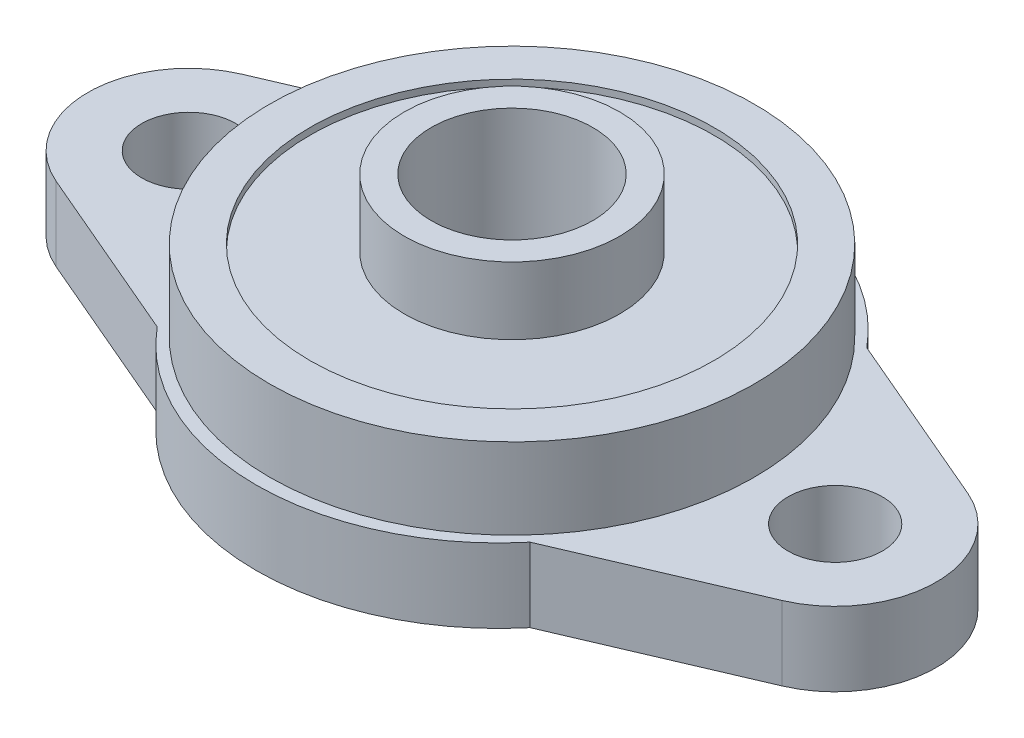
ISO-10303-21;
HEADER;
FILE_DESCRIPTION(('STEP AP214'),'2;1');
FILE_NAME('part.step','',(''),(''),'','','');
FILE_SCHEMA(('AUTOMOTIVE_DESIGN { 1 0 10303 214 1 1 1 1 }'));
ENDSEC;
DATA;
#1=APPLICATION_CONTEXT('core data for automotive mechanical design processes');
#2=APPLICATION_PROTOCOL_DEFINITION('international standard','automotive_design',2000,#1);
#3=PRODUCT_CONTEXT('',#1,'mechanical');
#4=PRODUCT('Part','Part','',(#3));
#5=PRODUCT_RELATED_PRODUCT_CATEGORY('part','',(#4));
#6=PRODUCT_DEFINITION_FORMATION('','',#4);
#7=PRODUCT_DEFINITION_CONTEXT('part definition',#1,'design');
#8=PRODUCT_DEFINITION('design','',#6,#7);
#9=PRODUCT_DEFINITION_SHAPE('','',#8);
#10=(LENGTH_UNIT() NAMED_UNIT(*) SI_UNIT(.MILLI.,.METRE.));
#11=(NAMED_UNIT(*) PLANE_ANGLE_UNIT() SI_UNIT($,.RADIAN.));
#12=(NAMED_UNIT(*) SI_UNIT($,.STERADIAN.) SOLID_ANGLE_UNIT());
#13=UNCERTAINTY_MEASURE_WITH_UNIT(LENGTH_MEASURE(1.E-05),#10,'distance_accuracy_value','');
#14=(GEOMETRIC_REPRESENTATION_CONTEXT(3) GLOBAL_UNCERTAINTY_ASSIGNED_CONTEXT((#13)) GLOBAL_UNIT_ASSIGNED_CONTEXT((#10,
#11,#12)) REPRESENTATION_CONTEXT('',''));
#15=CARTESIAN_POINT('',(0.,0.,0.));
#16=DIRECTION('',(0.,0.,1.));
#17=DIRECTION('',(1.,0.,0.));
#18=AXIS2_PLACEMENT_3D('',#15,#16,#17);
#19=CARTESIAN_POINT('',(0.,-5.5,0.));
#20=DIRECTION('',(0.,1.,0.));
#21=DIRECTION('',(0.,0.,1.));
#22=AXIS2_PLACEMENT_3D('',#19,#20,#21);
#23=PLANE('',#22);
#24=CARTESIAN_POINT('',(0.,-5.5,0.));
#25=DIRECTION('',(0.,1.,0.));
#26=DIRECTION('',(0.,0.,1.));
#27=AXIS2_PLACEMENT_3D('',#24,#25,#26);
#28=CIRCLE('',#27,6.);
#29=CARTESIAN_POINT('',(0.,-5.5,6.));
#30=VERTEX_POINT('',#29);
#31=EDGE_CURVE('E152',#30,#30,#28,.T.);
#32=ORIENTED_EDGE('',*,*,#31,.T.);
#33=EDGE_LOOP('',(#32));
#34=FACE_BOUND('',#33,.T.);
#35=CARTESIAN_POINT('',(0.,-5.5,0.));
#36=DIRECTION('',(0.,-1.,0.));
#37=DIRECTION('',(0.,0.,-1.));
#38=AXIS2_PLACEMENT_3D('',#35,#36,#37);
#39=CIRCLE('',#38,8.);
#40=CARTESIAN_POINT('',(0.,-5.5,-8.));
#41=VERTEX_POINT('',#40);
#42=EDGE_CURVE('E274',#41,#41,#39,.T.);
#43=ORIENTED_EDGE('',*,*,#42,.T.);
#44=EDGE_LOOP('',(#43));
#45=FACE_BOUND('',#44,.T.);
#46=ADVANCED_FACE('F42',(#34,#45),#23,.F.);
#47=CARTESIAN_POINT('',(24.,-5.5,0.));
#48=DIRECTION('',(0.,1.,0.));
#49=DIRECTION('',(0.,0.,1.));
#50=AXIS2_PLACEMENT_3D('',#47,#48,#49);
#51=CYLINDRICAL_SURFACE('',#50,7.50000000000001);
#52=CARTESIAN_POINT('',(24.,0.,0.));
#53=DIRECTION('',(0.,1.,0.));
#54=DIRECTION('',(0.,0.,1.));
#55=AXIS2_PLACEMENT_3D('',#52,#53,#54);
#56=CIRCLE('',#55,7.50000000000001);
#57=CARTESIAN_POINT('',(26.9495578824356,0.,-6.89565865586182));
#58=VERTEX_POINT('',#57);
#59=CARTESIAN_POINT('',(26.9495578824356,0.,6.89565865586182));
#60=VERTEX_POINT('',#59);
#61=EDGE_CURVE('E160',#58,#60,#56,.F.);
#62=ORIENTED_EDGE('',*,*,#61,.T.);
#63=DIRECTION('',(0.,1.,0.));
#64=VECTOR('',#63,1.);
#65=CARTESIAN_POINT('',(26.9495578824356,-5.5,6.89565865586182));
#66=LINE('',#65,#64);
#67=CARTESIAN_POINT('',(26.9495578824356,-5.5,6.89565865586182));
#68=VERTEX_POINT('',#67);
#69=EDGE_CURVE('E52',#68,#60,#66,.T.);
#70=ORIENTED_EDGE('',*,*,#69,.F.);
#71=CARTESIAN_POINT('',(24.,-5.5,0.));
#72=DIRECTION('',(0.,1.,0.));
#73=DIRECTION('',(0.,0.,1.));
#74=AXIS2_PLACEMENT_3D('',#71,#72,#73);
#75=CIRCLE('',#74,7.50000000000001);
#76=CARTESIAN_POINT('',(26.9495578824356,-5.5,-6.89565865586182));
#77=VERTEX_POINT('',#76);
#78=EDGE_CURVE('E211',#77,#68,#75,.F.);
#79=ORIENTED_EDGE('',*,*,#78,.F.);
#80=DIRECTION('',(0.,1.,0.));
#81=VECTOR('',#80,1.);
#82=CARTESIAN_POINT('',(26.9495578824356,-5.5,-6.89565865586182));
#83=LINE('',#82,#81);
#84=EDGE_CURVE('E102',#77,#58,#83,.T.);
#85=ORIENTED_EDGE('',*,*,#84,.T.);
#86=EDGE_LOOP('',(#62,#70,#79,#85));
#87=FACE_BOUND('',#86,.T.);
#88=ADVANCED_FACE('F209',(#87),#51,.T.);
#89=CARTESIAN_POINT('',(6.6615116752198,-5.5,15.5736935755344));
#90=DIRECTION('',(-0.393274384324746,0.,-0.919421154114909));
#91=DIRECTION('',(-0.919421154114909,0.,0.393274384324746));
#92=AXIS2_PLACEMENT_3D('',#89,#90,#91);
#93=PLANE('',#92);
#94=DIRECTION('',(-0.919421154114909,0.,0.393274384324746));
#95=VECTOR('',#94,1.);
#96=CARTESIAN_POINT('',(6.6615116752198,0.,15.5736935755344));
#97=LINE('',#96,#95);
#98=CARTESIAN_POINT('',(13.8473824241262,0.,12.5));
#99=VERTEX_POINT('',#98);
#100=EDGE_CURVE('E95',#60,#99,#97,.T.);
#101=ORIENTED_EDGE('',*,*,#100,.T.);
#102=DIRECTION('',(0.,1.,0.));
#103=VECTOR('',#102,1.);
#104=CARTESIAN_POINT('',(13.8473824241262,-5.5,12.5));
#105=LINE('',#104,#103);
#106=CARTESIAN_POINT('',(13.8473824241262,-5.5,12.5));
#107=VERTEX_POINT('',#106);
#108=EDGE_CURVE('E88',#107,#99,#105,.T.);
#109=ORIENTED_EDGE('',*,*,#108,.F.);
#110=DIRECTION('',(-0.919421154114909,0.,0.393274384324746));
#111=VECTOR('',#110,1.);
#112=CARTESIAN_POINT('',(6.6615116752198,-5.5,15.5736935755344));
#113=LINE('',#112,#111);
#114=EDGE_CURVE('E60',#68,#107,#113,.T.);
#115=ORIENTED_EDGE('',*,*,#114,.F.);
#116=ORIENTED_EDGE('',*,*,#69,.T.);
#117=EDGE_LOOP('',(#101,#109,#115,#116));
#118=FACE_BOUND('',#117,.T.);
#119=ADVANCED_FACE('F327',(#118),#93,.F.);
#120=CARTESIAN_POINT('',(0.,-5.5,1.));
#121=DIRECTION('',(0.,1.,0.));
#122=DIRECTION('',(0.,0.,1.));
#123=AXIS2_PLACEMENT_3D('',#120,#121,#122);
#124=CYLINDRICAL_SURFACE('',#123,18.);
#125=CARTESIAN_POINT('',(0.,0.,1.));
#126=DIRECTION('',(0.,1.,0.));
#127=DIRECTION('',(0.,0.,1.));
#128=AXIS2_PLACEMENT_3D('',#125,#126,#127);
#129=CIRCLE('',#128,18.);
#130=CARTESIAN_POINT('',(-13.8473824241262,0.,12.5));
#131=VERTEX_POINT('',#130);
#132=EDGE_CURVE('E120',#131,#99,#129,.T.);
#133=ORIENTED_EDGE('',*,*,#132,.F.);
#134=DIRECTION('',(0.,1.,0.));
#135=VECTOR('',#134,1.);
#136=CARTESIAN_POINT('',(-13.8473824241262,-5.5,12.5));
#137=LINE('',#136,#135);
#138=CARTESIAN_POINT('',(-13.8473824241262,-5.5,12.5));
#139=VERTEX_POINT('',#138);
#140=EDGE_CURVE('E116',#139,#131,#137,.T.);
#141=ORIENTED_EDGE('',*,*,#140,.F.);
#142=CARTESIAN_POINT('',(0.,-5.5,1.));
#143=DIRECTION('',(0.,1.,0.));
#144=DIRECTION('',(0.,0.,1.));
#145=AXIS2_PLACEMENT_3D('',#142,#143,#144);
#146=CIRCLE('',#145,18.);
#147=EDGE_CURVE('E119',#139,#107,#146,.T.);
#148=ORIENTED_EDGE('',*,*,#147,.T.);
#149=ORIENTED_EDGE('',*,*,#108,.T.);
#150=EDGE_LOOP('',(#133,#141,#148,#149));
#151=FACE_BOUND('',#150,.T.);
#152=ADVANCED_FACE('F118',(#151),#124,.T.);
#153=CARTESIAN_POINT('',(-6.66151167521981,-5.5,15.5736935755344));
#154=DIRECTION('',(-0.393274384324747,0.,0.919421154114909));
#155=DIRECTION('',(0.919421154114909,0.,0.393274384324747));
#156=AXIS2_PLACEMENT_3D('',#153,#154,#155);
#157=PLANE('',#156);
#158=DIRECTION('',(0.919421154114909,0.,0.393274384324747));
#159=VECTOR('',#158,1.);
#160=CARTESIAN_POINT('',(-6.66151167521981,0.,15.5736935755344));
#161=LINE('',#160,#159);
#162=CARTESIAN_POINT('',(-26.9495578824356,0.,6.89565865586182));
#163=VERTEX_POINT('',#162);
#164=EDGE_CURVE('E180',#163,#131,#161,.T.);
#165=ORIENTED_EDGE('',*,*,#164,.F.);
#166=DIRECTION('',(0.,1.,0.));
#167=VECTOR('',#166,1.);
#168=CARTESIAN_POINT('',(-26.9495578824356,-5.5,6.89565865586182));
#169=LINE('',#168,#167);
#170=CARTESIAN_POINT('',(-26.9495578824356,-5.5,6.89565865586182));
#171=VERTEX_POINT('',#170);
#172=EDGE_CURVE('E126',#171,#163,#169,.T.);
#173=ORIENTED_EDGE('',*,*,#172,.F.);
#174=DIRECTION('',(0.919421154114909,0.,0.393274384324747));
#175=VECTOR('',#174,1.);
#176=CARTESIAN_POINT('',(-6.66151167521981,-5.5,15.5736935755344));
#177=LINE('',#176,#175);
#178=EDGE_CURVE('E133',#171,#139,#177,.T.);
#179=ORIENTED_EDGE('',*,*,#178,.T.);
#180=ORIENTED_EDGE('',*,*,#140,.T.);
#181=EDGE_LOOP('',(#165,#173,#179,#180));
#182=FACE_BOUND('',#181,.T.);
#183=ADVANCED_FACE('F137',(#182),#157,.T.);
#184=CARTESIAN_POINT('',(-24.,-5.5,0.));
#185=DIRECTION('',(0.,1.,0.));
#186=DIRECTION('',(0.,0.,1.));
#187=AXIS2_PLACEMENT_3D('',#184,#185,#186);
#188=CYLINDRICAL_SURFACE('',#187,7.5);
#189=CARTESIAN_POINT('',(-24.,0.,0.));
#190=DIRECTION('',(0.,1.,0.));
#191=DIRECTION('',(0.,0.,1.));
#192=AXIS2_PLACEMENT_3D('',#189,#190,#191);
#193=CIRCLE('',#192,7.5);
#194=CARTESIAN_POINT('',(-26.9495578824356,0.,-6.89565865586182));
#195=VERTEX_POINT('',#194);
#196=EDGE_CURVE('E176',#195,#163,#193,.T.);
#197=ORIENTED_EDGE('',*,*,#196,.F.);
#198=DIRECTION('',(0.,1.,0.));
#199=VECTOR('',#198,1.);
#200=CARTESIAN_POINT('',(-26.9495578824356,-5.5,-6.89565865586182));
#201=LINE('',#200,#199);
#202=CARTESIAN_POINT('',(-26.9495578824356,-5.5,-6.89565865586182));
#203=VERTEX_POINT('',#202);
#204=EDGE_CURVE('E198',#203,#195,#201,.T.);
#205=ORIENTED_EDGE('',*,*,#204,.F.);
#206=CARTESIAN_POINT('',(-24.,-5.5,0.));
#207=DIRECTION('',(0.,1.,0.));
#208=DIRECTION('',(0.,0.,1.));
#209=AXIS2_PLACEMENT_3D('',#206,#207,#208);
#210=CIRCLE('',#209,7.5);
#211=EDGE_CURVE('E139',#203,#171,#210,.T.);
#212=ORIENTED_EDGE('',*,*,#211,.T.);
#213=ORIENTED_EDGE('',*,*,#172,.T.);
#214=EDGE_LOOP('',(#197,#205,#212,#213));
#215=FACE_BOUND('',#214,.T.);
#216=ADVANCED_FACE('F227',(#215),#188,.T.);
#217=CARTESIAN_POINT('',(-6.66151167521981,-5.5,-15.5736935755344));
#218=DIRECTION('',(0.393274384324747,0.,0.919421154114909));
#219=DIRECTION('',(0.919421154114909,0.,-0.393274384324747));
#220=AXIS2_PLACEMENT_3D('',#217,#218,#219);
#221=PLANE('',#220);
#222=DIRECTION('',(0.919421154114909,0.,-0.393274384324747));
#223=VECTOR('',#222,1.);
#224=CARTESIAN_POINT('',(-6.66151167521981,0.,-15.5736935755344));
#225=LINE('',#224,#223);
#226=CARTESIAN_POINT('',(-13.8473824241262,0.,-12.5));
#227=VERTEX_POINT('',#226);
#228=EDGE_CURVE('E173',#195,#227,#225,.T.);
#229=ORIENTED_EDGE('',*,*,#228,.T.);
#230=DIRECTION('',(0.,1.,0.));
#231=VECTOR('',#230,1.);
#232=CARTESIAN_POINT('',(-13.8473824241262,-5.5,-12.5));
#233=LINE('',#232,#231);
#234=CARTESIAN_POINT('',(-13.8473824241262,-5.5,-12.5));
#235=VERTEX_POINT('',#234);
#236=EDGE_CURVE('E201',#235,#227,#233,.T.);
#237=ORIENTED_EDGE('',*,*,#236,.F.);
#238=DIRECTION('',(0.919421154114909,0.,-0.393274384324747));
#239=VECTOR('',#238,1.);
#240=CARTESIAN_POINT('',(-6.66151167521981,-5.5,-15.5736935755344));
#241=LINE('',#240,#239);
#242=EDGE_CURVE('E142',#203,#235,#241,.T.);
#243=ORIENTED_EDGE('',*,*,#242,.F.);
#244=ORIENTED_EDGE('',*,*,#204,.T.);
#245=EDGE_LOOP('',(#229,#237,#243,#244));
#246=FACE_BOUND('',#245,.T.);
#247=ADVANCED_FACE('F231',(#246),#221,.F.);
#248=CARTESIAN_POINT('',(0.,-5.5,-1.));
#249=DIRECTION('',(0.,1.,0.));
#250=DIRECTION('',(0.,0.,1.));
#251=AXIS2_PLACEMENT_3D('',#248,#249,#250);
#252=CYLINDRICAL_SURFACE('',#251,18.);
#253=CARTESIAN_POINT('',(0.,0.,-1.));
#254=DIRECTION('',(0.,1.,0.));
#255=DIRECTION('',(0.,0.,1.));
#256=AXIS2_PLACEMENT_3D('',#253,#254,#255);
#257=CIRCLE('',#256,18.);
#258=CARTESIAN_POINT('',(13.8473824241262,0.,-12.5));
#259=VERTEX_POINT('',#258);
#260=EDGE_CURVE('E169',#227,#259,#257,.F.);
#261=ORIENTED_EDGE('',*,*,#260,.T.);
#262=DIRECTION('',(0.,1.,0.));
#263=VECTOR('',#262,1.);
#264=CARTESIAN_POINT('',(13.8473824241262,-5.5,-12.5));
#265=LINE('',#264,#263);
#266=CARTESIAN_POINT('',(13.8473824241262,-5.5,-12.5));
#267=VERTEX_POINT('',#266);
#268=EDGE_CURVE('E205',#267,#259,#265,.T.);
#269=ORIENTED_EDGE('',*,*,#268,.F.);
#270=CARTESIAN_POINT('',(0.,-5.5,-1.));
#271=DIRECTION('',(0.,1.,0.));
#272=DIRECTION('',(0.,0.,1.));
#273=AXIS2_PLACEMENT_3D('',#270,#271,#272);
#274=CIRCLE('',#273,18.);
#275=EDGE_CURVE('E229',#235,#267,#274,.F.);
#276=ORIENTED_EDGE('',*,*,#275,.F.);
#277=ORIENTED_EDGE('',*,*,#236,.T.);
#278=EDGE_LOOP('',(#261,#269,#276,#277));
#279=FACE_BOUND('',#278,.T.);
#280=ADVANCED_FACE('F221',(#279),#252,.T.);
#281=CARTESIAN_POINT('',(24.,-5.5,0.));
#282=DIRECTION('',(0.,1.,0.));
#283=DIRECTION('',(0.,0.,1.));
#284=AXIS2_PLACEMENT_3D('',#281,#282,#283);
#285=CYLINDRICAL_SURFACE('',#284,3.5);
#286=CARTESIAN_POINT('',(24.,-5.5,0.));
#287=DIRECTION('',(0.,1.,0.));
#288=DIRECTION('',(0.,0.,1.));
#289=AXIS2_PLACEMENT_3D('',#286,#287,#288);
#290=CIRCLE('',#289,3.5);
#291=CARTESIAN_POINT('',(24.,-5.5,3.50000000000001));
#292=VERTEX_POINT('',#291);
#293=EDGE_CURVE('E148',#292,#292,#290,.F.);
#294=ORIENTED_EDGE('',*,*,#293,.T.);
#295=EDGE_LOOP('',(#294));
#296=FACE_BOUND('',#295,.T.);
#297=CARTESIAN_POINT('',(24.,0.,0.));
#298=DIRECTION('',(0.,1.,0.));
#299=DIRECTION('',(0.,0.,1.));
#300=AXIS2_PLACEMENT_3D('',#297,#298,#299);
#301=CIRCLE('',#300,3.5);
#302=CARTESIAN_POINT('',(24.,0.,3.50000000000001));
#303=VERTEX_POINT('',#302);
#304=EDGE_CURVE('E187',#303,#303,#301,.F.);
#305=ORIENTED_EDGE('',*,*,#304,.F.);
#306=EDGE_LOOP('',(#305));
#307=FACE_BOUND('',#306,.T.);
#308=ADVANCED_FACE('F430',(#296,#307),#285,.F.);
#309=CARTESIAN_POINT('',(6.6615116752198,-5.5,-15.5736935755344));
#310=DIRECTION('',(0.393274384324746,0.,-0.919421154114909));
#311=DIRECTION('',(-0.919421154114909,0.,-0.393274384324746));
#312=AXIS2_PLACEMENT_3D('',#309,#310,#311);
#313=PLANE('',#312);
#314=DIRECTION('',(-0.919421154114909,0.,-0.393274384324746));
#315=VECTOR('',#314,1.);
#316=CARTESIAN_POINT('',(6.6615116752198,0.,-15.5736935755344));
#317=LINE('',#316,#315);
#318=EDGE_CURVE('E165',#58,#259,#317,.T.);
#319=ORIENTED_EDGE('',*,*,#318,.F.);
#320=ORIENTED_EDGE('',*,*,#84,.F.);
#321=DIRECTION('',(-0.919421154114909,0.,-0.393274384324746));
#322=VECTOR('',#321,1.);
#323=CARTESIAN_POINT('',(6.6615116752198,-5.5,-15.5736935755344));
#324=LINE('',#323,#322);
#325=EDGE_CURVE('E218',#77,#267,#324,.T.);
#326=ORIENTED_EDGE('',*,*,#325,.T.);
#327=ORIENTED_EDGE('',*,*,#268,.T.);
#328=EDGE_LOOP('',(#319,#320,#326,#327));
#329=FACE_BOUND('',#328,.T.);
#330=ADVANCED_FACE('F216',(#329),#313,.T.);
#331=CARTESIAN_POINT('',(-24.,-5.5,0.));
#332=DIRECTION('',(0.,1.,0.));
#333=DIRECTION('',(0.,0.,1.));
#334=AXIS2_PLACEMENT_3D('',#331,#332,#333);
#335=CYLINDRICAL_SURFACE('',#334,3.5);
#336=CARTESIAN_POINT('',(-24.,-5.5,0.));
#337=DIRECTION('',(0.,1.,0.));
#338=DIRECTION('',(0.,0.,1.));
#339=AXIS2_PLACEMENT_3D('',#336,#337,#338);
#340=CIRCLE('',#339,3.5);
#341=CARTESIAN_POINT('',(-24.,-5.5,3.5));
#342=VERTEX_POINT('',#341);
#343=EDGE_CURVE('E191',#342,#342,#340,.T.);
#344=ORIENTED_EDGE('',*,*,#343,.F.);
#345=EDGE_LOOP('',(#344));
#346=FACE_BOUND('',#345,.T.);
#347=CARTESIAN_POINT('',(-24.,0.,0.));
#348=DIRECTION('',(0.,1.,0.));
#349=DIRECTION('',(0.,0.,1.));
#350=AXIS2_PLACEMENT_3D('',#347,#348,#349);
#351=CIRCLE('',#350,3.5);
#352=CARTESIAN_POINT('',(-24.,0.,3.5));
#353=VERTEX_POINT('',#352);
#354=EDGE_CURVE('E156',#353,#353,#351,.T.);
#355=ORIENTED_EDGE('',*,*,#354,.T.);
#356=EDGE_LOOP('',(#355));
#357=FACE_BOUND('',#356,.T.);
#358=ADVANCED_FACE('F44',(#346,#357),#335,.F.);
#359=CARTESIAN_POINT('',(0.,-5.5,0.));
#360=DIRECTION('',(0.,1.,0.));
#361=DIRECTION('',(0.,0.,1.));
#362=AXIS2_PLACEMENT_3D('',#359,#360,#361);
#363=CYLINDRICAL_SURFACE('',#362,6.);
#364=ORIENTED_EDGE('',*,*,#31,.F.);
#365=EDGE_LOOP('',(#364));
#366=FACE_BOUND('',#365,.T.);
#367=CARTESIAN_POINT('',(0.,10.5,0.));
#368=DIRECTION('',(0.,1.,0.));
#369=DIRECTION('',(0.,0.,1.));
#370=AXIS2_PLACEMENT_3D('',#367,#368,#369);
#371=CIRCLE('',#370,6.);
#372=CARTESIAN_POINT('',(0.,10.5,6.));
#373=VERTEX_POINT('',#372);
#374=EDGE_CURVE('E261',#373,#373,#371,.T.);
#375=ORIENTED_EDGE('',*,*,#374,.T.);
#376=EDGE_LOOP('',(#375));
#377=FACE_BOUND('',#376,.T.);
#378=ADVANCED_FACE('F300',(#366,#377),#363,.F.);
#379=CARTESIAN_POINT('',(0.,-5.5,0.));
#380=DIRECTION('',(0.,-1.,0.));
#381=DIRECTION('',(0.,0.,-1.));
#382=AXIS2_PLACEMENT_3D('',#379,#380,#381);
#383=CIRCLE('',#382,15.);
#384=CARTESIAN_POINT('',(0.,-5.5,-15.));
#385=VERTEX_POINT('',#384);
#386=EDGE_CURVE('E266',#385,#385,#383,.T.);
#387=ORIENTED_EDGE('',*,*,#386,.F.);
#388=EDGE_LOOP('',(#387));
#389=FACE_BOUND('',#388,.T.);
#390=ORIENTED_EDGE('',*,*,#343,.T.);
#391=EDGE_LOOP('',(#390));
#392=FACE_BOUND('',#391,.T.);
#393=ORIENTED_EDGE('',*,*,#78,.T.);
#394=ORIENTED_EDGE('',*,*,#114,.T.);
#395=ORIENTED_EDGE('',*,*,#147,.F.);
#396=ORIENTED_EDGE('',*,*,#178,.F.);
#397=ORIENTED_EDGE('',*,*,#211,.F.);
#398=ORIENTED_EDGE('',*,*,#242,.T.);
#399=ORIENTED_EDGE('',*,*,#275,.T.);
#400=ORIENTED_EDGE('',*,*,#325,.F.);
#401=EDGE_LOOP('',(#393,#394,#395,#396,#397,#398,#399,#400));
#402=FACE_BOUND('',#401,.T.);
#403=ORIENTED_EDGE('',*,*,#293,.F.);
#404=EDGE_LOOP('',(#403));
#405=FACE_BOUND('',#404,.T.);
#406=ADVANCED_FACE('F130',(#389,#392,#402,#405),#23,.F.);
#407=CARTESIAN_POINT('',(0.,0.,0.));
#408=DIRECTION('',(0.,1.,0.));
#409=DIRECTION('',(0.,0.,1.));
#410=AXIS2_PLACEMENT_3D('',#407,#408,#409);
#411=PLANE('',#410);
#412=CARTESIAN_POINT('',(0.,0.,0.));
#413=DIRECTION('',(0.,1.,0.));
#414=DIRECTION('',(0.,0.,1.));
#415=AXIS2_PLACEMENT_3D('',#412,#413,#414);
#416=CIRCLE('',#415,18.);
#417=CARTESIAN_POINT('',(0.,0.,18.));
#418=VERTEX_POINT('',#417);
#419=EDGE_CURVE('E242',#418,#418,#416,.T.);
#420=ORIENTED_EDGE('',*,*,#419,.F.);
#421=EDGE_LOOP('',(#420));
#422=FACE_BOUND('',#421,.T.);
#423=ORIENTED_EDGE('',*,*,#354,.F.);
#424=EDGE_LOOP('',(#423));
#425=FACE_BOUND('',#424,.T.);
#426=ORIENTED_EDGE('',*,*,#61,.F.);
#427=ORIENTED_EDGE('',*,*,#318,.T.);
#428=ORIENTED_EDGE('',*,*,#260,.F.);
#429=ORIENTED_EDGE('',*,*,#228,.F.);
#430=ORIENTED_EDGE('',*,*,#196,.T.);
#431=ORIENTED_EDGE('',*,*,#164,.T.);
#432=ORIENTED_EDGE('',*,*,#132,.T.);
#433=ORIENTED_EDGE('',*,*,#100,.F.);
#434=EDGE_LOOP('',(#426,#427,#428,#429,#430,#431,#432,#433));
#435=FACE_BOUND('',#434,.T.);
#436=ORIENTED_EDGE('',*,*,#304,.T.);
#437=EDGE_LOOP('',(#436));
#438=FACE_BOUND('',#437,.T.);
#439=ADVANCED_FACE('F213',(#422,#425,#435,#438),#411,.T.);
#440=CARTESIAN_POINT('',(0.,6.,0.));
#441=DIRECTION('',(0.,-1.,0.));
#442=DIRECTION('',(0.,0.,-1.));
#443=AXIS2_PLACEMENT_3D('',#440,#441,#442);
#444=CYLINDRICAL_SURFACE('',#443,15.);
#445=CARTESIAN_POINT('',(0.,5.5,0.));
#446=DIRECTION('',(0.,1.,0.));
#447=DIRECTION('',(0.,0.,1.));
#448=AXIS2_PLACEMENT_3D('',#445,#446,#447);
#449=CIRCLE('',#448,15.);
#450=CARTESIAN_POINT('',(0.,5.5,15.));
#451=VERTEX_POINT('',#450);
#452=EDGE_CURVE('E11',#451,#451,#449,.T.);
#453=ORIENTED_EDGE('',*,*,#452,.F.);
#454=EDGE_LOOP('',(#453));
#455=FACE_BOUND('',#454,.T.);
#456=CARTESIAN_POINT('',(0.,6.,0.));
#457=DIRECTION('',(0.,1.,0.));
#458=DIRECTION('',(0.,0.,1.));
#459=AXIS2_PLACEMENT_3D('',#456,#457,#458);
#460=CIRCLE('',#459,15.);
#461=CARTESIAN_POINT('',(0.,6.,15.));
#462=VERTEX_POINT('',#461);
#463=EDGE_CURVE('E246',#462,#462,#460,.T.);
#464=ORIENTED_EDGE('',*,*,#463,.T.);
#465=EDGE_LOOP('',(#464));
#466=FACE_BOUND('',#465,.T.);
#467=ADVANCED_FACE('F309',(#455,#466),#444,.F.);
#468=CARTESIAN_POINT('',(0.,6.,0.));
#469=DIRECTION('',(0.,-1.,0.));
#470=DIRECTION('',(0.,0.,-1.));
#471=AXIS2_PLACEMENT_3D('',#468,#469,#470);
#472=CYLINDRICAL_SURFACE('',#471,18.);
#473=CARTESIAN_POINT('',(0.,6.,0.));
#474=DIRECTION('',(0.,1.,0.));
#475=DIRECTION('',(0.,0.,1.));
#476=AXIS2_PLACEMENT_3D('',#473,#474,#475);
#477=CIRCLE('',#476,18.);
#478=CARTESIAN_POINT('',(0.,6.,18.));
#479=VERTEX_POINT('',#478);
#480=EDGE_CURVE('E161',#479,#479,#477,.T.);
#481=ORIENTED_EDGE('',*,*,#480,.F.);
#482=EDGE_LOOP('',(#481));
#483=FACE_BOUND('',#482,.T.);
#484=ORIENTED_EDGE('',*,*,#419,.T.);
#485=EDGE_LOOP('',(#484));
#486=FACE_BOUND('',#485,.T.);
#487=ADVANCED_FACE('F316',(#483,#486),#472,.T.);
#488=CARTESIAN_POINT('',(0.,6.,0.));
#489=DIRECTION('',(0.,1.,0.));
#490=DIRECTION('',(0.,0.,1.));
#491=AXIS2_PLACEMENT_3D('',#488,#489,#490);
#492=PLANE('',#491);
#493=ORIENTED_EDGE('',*,*,#463,.F.);
#494=EDGE_LOOP('',(#493));
#495=FACE_BOUND('',#494,.T.);
#496=ORIENTED_EDGE('',*,*,#480,.T.);
#497=EDGE_LOOP('',(#496));
#498=FACE_BOUND('',#497,.T.);
#499=ADVANCED_FACE('F332',(#495,#498),#492,.T.);
#500=CARTESIAN_POINT('',(0.,5.5,0.));
#501=DIRECTION('',(0.,1.,0.));
#502=DIRECTION('',(0.,0.,1.));
#503=AXIS2_PLACEMENT_3D('',#500,#501,#502);
#504=PLANE('',#503);
#505=CARTESIAN_POINT('',(0.,5.5,0.));
#506=DIRECTION('',(0.,1.,0.));
#507=DIRECTION('',(0.,0.,1.));
#508=AXIS2_PLACEMENT_3D('',#505,#506,#507);
#509=CIRCLE('',#508,8.);
#510=CARTESIAN_POINT('',(0.,5.5,-8.));
#511=VERTEX_POINT('',#510);
#512=EDGE_CURVE('E247',#511,#511,#509,.T.);
#513=ORIENTED_EDGE('',*,*,#512,.F.);
#514=EDGE_LOOP('',(#513));
#515=FACE_BOUND('',#514,.T.);
#516=ORIENTED_EDGE('',*,*,#452,.T.);
#517=EDGE_LOOP('',(#516));
#518=FACE_BOUND('',#517,.T.);
#519=ADVANCED_FACE('F336',(#515,#518),#504,.T.);
#520=CARTESIAN_POINT('',(0.,10.5,0.));
#521=DIRECTION('',(0.,-1.,0.));
#522=DIRECTION('',(0.,0.,-1.));
#523=AXIS2_PLACEMENT_3D('',#520,#521,#522);
#524=CYLINDRICAL_SURFACE('',#523,8.);
#525=CARTESIAN_POINT('',(0.,10.5,0.));
#526=DIRECTION('',(0.,1.,0.));
#527=DIRECTION('',(0.,0.,1.));
#528=AXIS2_PLACEMENT_3D('',#525,#526,#527);
#529=CIRCLE('',#528,8.);
#530=CARTESIAN_POINT('',(0.,10.5,-8.));
#531=VERTEX_POINT('',#530);
#532=EDGE_CURVE('E257',#531,#531,#529,.T.);
#533=CARTESIAN_POINT('',(0.,5.5,-8.));
#534=CARTESIAN_POINT('',(0.,5.55208333333333,-8.));
#535=CARTESIAN_POINT('',(0.,5.60416666666667,-8.));
#536=CARTESIAN_POINT('',(0.,5.70833333333333,-8.));
#537=CARTESIAN_POINT('',(0.,5.76041666666667,-8.));
#538=CARTESIAN_POINT('',(0.,5.86458333333333,-8.));
#539=CARTESIAN_POINT('',(0.,5.91666666666667,-8.));
#540=CARTESIAN_POINT('',(0.,6.02083333333333,-8.));
#541=CARTESIAN_POINT('',(0.,6.07291666666667,-8.));
#542=CARTESIAN_POINT('',(0.,6.17708333333333,-8.));
#543=CARTESIAN_POINT('',(0.,6.22916666666667,-8.));
#544=CARTESIAN_POINT('',(0.,6.33333333333333,-8.));
#545=CARTESIAN_POINT('',(0.,6.38541666666667,-8.));
#546=CARTESIAN_POINT('',(0.,6.48958333333333,-8.));
#547=CARTESIAN_POINT('',(0.,6.54166666666667,-8.));
#548=CARTESIAN_POINT('',(0.,6.64583333333333,-8.));
#549=CARTESIAN_POINT('',(0.,6.69791666666667,-8.));
#550=CARTESIAN_POINT('',(0.,6.80208333333333,-8.));
#551=CARTESIAN_POINT('',(0.,6.85416666666667,-8.));
#552=CARTESIAN_POINT('',(0.,6.95833333333333,-8.));
#553=CARTESIAN_POINT('',(0.,7.01041666666667,-8.));
#554=CARTESIAN_POINT('',(0.,7.11458333333333,-8.));
#555=CARTESIAN_POINT('',(0.,7.16666666666667,-8.));
#556=CARTESIAN_POINT('',(0.,7.27083333333333,-8.));
#557=CARTESIAN_POINT('',(0.,7.32291666666667,-8.));
#558=CARTESIAN_POINT('',(0.,7.42708333333333,-8.));
#559=CARTESIAN_POINT('',(0.,7.47916666666667,-8.));
#560=CARTESIAN_POINT('',(0.,7.58333333333333,-8.));
#561=CARTESIAN_POINT('',(0.,7.63541666666667,-8.));
#562=CARTESIAN_POINT('',(0.,7.73958333333333,-8.));
#563=CARTESIAN_POINT('',(0.,7.79166666666667,-8.));
#564=CARTESIAN_POINT('',(0.,7.89583333333333,-8.));
#565=CARTESIAN_POINT('',(0.,7.94791666666667,-8.));
#566=CARTESIAN_POINT('',(0.,8.05208333333333,-8.));
#567=CARTESIAN_POINT('',(0.,8.10416666666667,-8.));
#568=CARTESIAN_POINT('',(0.,8.20833333333333,-8.));
#569=CARTESIAN_POINT('',(0.,8.26041666666667,-8.));
#570=CARTESIAN_POINT('',(0.,8.36458333333333,-8.));
#571=CARTESIAN_POINT('',(0.,8.41666666666667,-8.));
#572=CARTESIAN_POINT('',(0.,8.52083333333333,-8.));
#573=CARTESIAN_POINT('',(0.,8.57291666666667,-8.));
#574=CARTESIAN_POINT('',(0.,8.67708333333333,-8.));
#575=CARTESIAN_POINT('',(0.,8.72916666666667,-8.));
#576=CARTESIAN_POINT('',(0.,8.83333333333333,-8.));
#577=CARTESIAN_POINT('',(0.,8.88541666666667,-8.));
#578=CARTESIAN_POINT('',(0.,8.98958333333333,-8.));
#579=CARTESIAN_POINT('',(0.,9.04166666666667,-8.));
#580=CARTESIAN_POINT('',(0.,9.14583333333333,-8.));
#581=CARTESIAN_POINT('',(0.,9.19791666666667,-8.));
#582=CARTESIAN_POINT('',(0.,9.30208333333333,-8.));
#583=CARTESIAN_POINT('',(0.,9.35416666666667,-8.));
#584=CARTESIAN_POINT('',(0.,9.45833333333333,-8.));
#585=CARTESIAN_POINT('',(0.,9.51041666666667,-8.));
#586=CARTESIAN_POINT('',(0.,9.61458333333333,-8.));
#587=CARTESIAN_POINT('',(0.,9.66666666666667,-8.));
#588=CARTESIAN_POINT('',(0.,9.77083333333333,-8.));
#589=CARTESIAN_POINT('',(0.,9.82291666666667,-8.));
#590=CARTESIAN_POINT('',(0.,9.92708333333333,-8.));
#591=CARTESIAN_POINT('',(0.,9.97916666666667,-8.));
#592=CARTESIAN_POINT('',(0.,10.0833333333333,-8.));
#593=CARTESIAN_POINT('',(0.,10.1354166666667,-8.));
#594=CARTESIAN_POINT('',(0.,10.2395833333333,-8.));
#595=CARTESIAN_POINT('',(0.,10.2916666666667,-8.));
#596=CARTESIAN_POINT('',(0.,10.3958333333333,-8.));
#597=CARTESIAN_POINT('',(0.,10.4479166666667,-8.));
#598=CARTESIAN_POINT('',(0.,10.5,-8.));
#599=B_SPLINE_CURVE_WITH_KNOTS('',3,(#533,#534,#535,#536,#537,#538,#539,#540,#541,#542,#543,
#544,#545,#546,#547,#548,#549,#550,#551,#552,#553,#554,#555,#556,#557,#558,#559,#560,#561,#562,
#563,#564,#565,#566,#567,#568,#569,#570,#571,#572,#573,#574,#575,#576,#577,#578,#579,#580,#581,
#582,#583,#584,#585,#586,#587,#588,#589,#590,#591,#592,#593,#594,#595,#596,#597,#598),
.UNSPECIFIED.,.F.,.F.,(4,2,2,2,2,2,2,2,2,2,2,2,2,2,2,2,2,2,2,2,2,2,2,2,2,2,2,2,2,2,2,2,4),(0.,
0.15625,0.3125,0.46875,0.625000000000001,0.781250000000001,0.937500000000001,1.09375,1.25,
1.40625,1.5625,1.71875,1.875,2.03125,2.1875,2.34375,2.5,2.65625,2.8125,2.96875,3.125,3.28125,
3.4375,3.59375,3.75,3.90625,4.0625,4.21875,4.375,4.53125,4.6875,4.84375,5.),.UNSPECIFIED.);
#600=EDGE_CURVE('BSEAM340',#511,#531,#599,.T.);
#601=ORIENTED_EDGE('',*,*,#512,.T.);
#602=ORIENTED_EDGE('',*,*,#532,.F.);
#603=ORIENTED_EDGE('',*,*,#600,.T.);
#604=ORIENTED_EDGE('',*,*,#600,.F.);
#605=EDGE_LOOP('',(#601,#603,#602,#604));
#606=FACE_BOUND('',#605,.T.);
#607=ADVANCED_FACE('F340',(#606),#524,.T.);
#608=CARTESIAN_POINT('',(0.,10.5,0.));
#609=DIRECTION('',(0.,1.,0.));
#610=DIRECTION('',(0.,0.,1.));
#611=AXIS2_PLACEMENT_3D('',#608,#609,#610);
#612=PLANE('',#611);
#613=ORIENTED_EDGE('',*,*,#374,.F.);
#614=EDGE_LOOP('',(#613));
#615=FACE_BOUND('',#614,.T.);
#616=ORIENTED_EDGE('',*,*,#532,.T.);
#617=EDGE_LOOP('',(#616));
#618=FACE_BOUND('',#617,.T.);
#619=ADVANCED_FACE('F294',(#615,#618),#612,.T.);
#620=CARTESIAN_POINT('',(0.,-5.,0.));
#621=DIRECTION('',(0.,-1.,0.));
#622=DIRECTION('',(0.,0.,-1.));
#623=AXIS2_PLACEMENT_3D('',#620,#621,#622);
#624=CYLINDRICAL_SURFACE('',#623,15.);
#625=CARTESIAN_POINT('',(0.,-5.,0.));
#626=DIRECTION('',(0.,-1.,0.));
#627=DIRECTION('',(0.,0.,-1.));
#628=AXIS2_PLACEMENT_3D('',#625,#626,#627);
#629=CIRCLE('',#628,15.);
#630=CARTESIAN_POINT('',(0.,-5.,-15.));
#631=VERTEX_POINT('',#630);
#632=EDGE_CURVE('E265',#631,#631,#629,.T.);
#633=ORIENTED_EDGE('',*,*,#632,.F.);
#634=EDGE_LOOP('',(#633));
#635=FACE_BOUND('',#634,.T.);
#636=ORIENTED_EDGE('',*,*,#386,.T.);
#637=EDGE_LOOP('',(#636));
#638=FACE_BOUND('',#637,.T.);
#639=ADVANCED_FACE('F288',(#635,#638),#624,.F.);
#640=CARTESIAN_POINT('',(0.,-5.,0.));
#641=DIRECTION('',(0.,-1.,0.));
#642=DIRECTION('',(0.,0.,-1.));
#643=AXIS2_PLACEMENT_3D('',#640,#641,#642);
#644=PLANE('',#643);
#645=CARTESIAN_POINT('',(0.,-5.,0.));
#646=DIRECTION('',(0.,-1.,0.));
#647=DIRECTION('',(0.,0.,-1.));
#648=AXIS2_PLACEMENT_3D('',#645,#646,#647);
#649=CIRCLE('',#648,8.);
#650=CARTESIAN_POINT('',(0.,-5.,-8.));
#651=VERTEX_POINT('',#650);
#652=EDGE_CURVE('E270',#651,#651,#649,.T.);
#653=ORIENTED_EDGE('',*,*,#652,.F.);
#654=EDGE_LOOP('',(#653));
#655=FACE_BOUND('',#654,.T.);
#656=ORIENTED_EDGE('',*,*,#632,.T.);
#657=EDGE_LOOP('',(#656));
#658=FACE_BOUND('',#657,.T.);
#659=ADVANCED_FACE('F285',(#655,#658),#644,.T.);
#660=CARTESIAN_POINT('',(0.,-5.,0.));
#661=DIRECTION('',(0.,-1.,0.));
#662=DIRECTION('',(0.,0.,-1.));
#663=AXIS2_PLACEMENT_3D('',#660,#661,#662);
#664=CYLINDRICAL_SURFACE('',#663,8.);
#665=ORIENTED_EDGE('',*,*,#652,.T.);
#666=EDGE_LOOP('',(#665));
#667=FACE_BOUND('',#666,.T.);
#668=ORIENTED_EDGE('',*,*,#42,.F.);
#669=EDGE_LOOP('',(#668));
#670=FACE_BOUND('',#669,.T.);
#671=ADVANCED_FACE('F282',(#667,#670),#664,.T.);
#672=CLOSED_SHELL('',(#46,#88,#119,#152,#183,#216,#247,#280,#308,#330,#358,#378,#406,#439,#467,
#487,#499,#519,#607,#619,#639,#659,#671));
#673=MANIFOLD_SOLID_BREP('B2',#672);
#674=ADVANCED_BREP_SHAPE_REPRESENTATION('',(#18,#673),#14);
#675=SHAPE_DEFINITION_REPRESENTATION(#9,#674);
ENDSEC;
END-ISO-10303-21;
